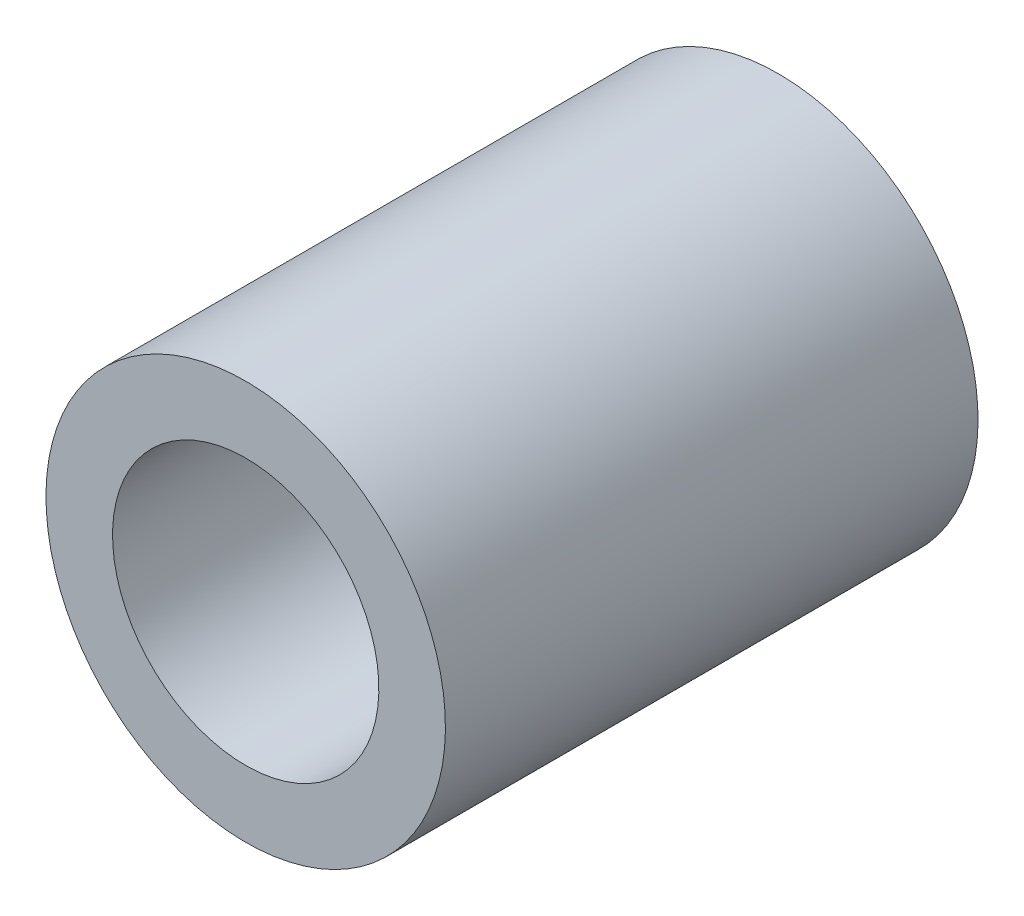
ISO-10303-21;
HEADER;
FILE_DESCRIPTION(('STEP AP214'),'2;1');
FILE_NAME('part.step','',(''),(''),'','','');
FILE_SCHEMA(('AUTOMOTIVE_DESIGN { 1 0 10303 214 1 1 1 1 }'));
ENDSEC;
DATA;
#1=APPLICATION_CONTEXT('core data for automotive mechanical design processes');
#2=APPLICATION_PROTOCOL_DEFINITION('international standard','automotive_design',2000,#1);
#3=PRODUCT_CONTEXT('',#1,'mechanical');
#4=PRODUCT('Part','Part','',(#3));
#5=PRODUCT_RELATED_PRODUCT_CATEGORY('part','',(#4));
#6=PRODUCT_DEFINITION_FORMATION('','',#4);
#7=PRODUCT_DEFINITION_CONTEXT('part definition',#1,'design');
#8=PRODUCT_DEFINITION('design','',#6,#7);
#9=PRODUCT_DEFINITION_SHAPE('','',#8);
#10=(LENGTH_UNIT() NAMED_UNIT(*) SI_UNIT(.MILLI.,.METRE.));
#11=(NAMED_UNIT(*) PLANE_ANGLE_UNIT() SI_UNIT($,.RADIAN.));
#12=(NAMED_UNIT(*) SI_UNIT($,.STERADIAN.) SOLID_ANGLE_UNIT());
#13=UNCERTAINTY_MEASURE_WITH_UNIT(LENGTH_MEASURE(1.E-05),#10,'distance_accuracy_value','');
#14=(GEOMETRIC_REPRESENTATION_CONTEXT(3) GLOBAL_UNCERTAINTY_ASSIGNED_CONTEXT((#13)) GLOBAL_UNIT_ASSIGNED_CONTEXT((#10,
#11,#12)) REPRESENTATION_CONTEXT('',''));
#15=CARTESIAN_POINT('',(0.,0.,0.));
#16=DIRECTION('',(0.,0.,1.));
#17=DIRECTION('',(1.,0.,0.));
#18=AXIS2_PLACEMENT_3D('',#15,#16,#17);
#19=CARTESIAN_POINT('',(69.9596903297769,144.74572943156,362.374757541018));
#20=DIRECTION('',(0.,0.,-1.));
#21=DIRECTION('',(0.173648177666928,0.984807753012209,0.));
#22=AXIS2_PLACEMENT_3D('',#19,#20,#21);
#23=CYLINDRICAL_SURFACE('',#22,2.);
#24=CARTESIAN_POINT('',(69.9596903297769,144.74572943156,356.374757541018));
#25=DIRECTION('',(0.,0.,-1.));
#26=DIRECTION('',(0.173648177666928,0.984807753012209,0.));
#27=AXIS2_PLACEMENT_3D('',#24,#25,#26);
#28=CIRCLE('',#27,2.);
#29=CARTESIAN_POINT('',(70.3069866851108,146.715344937585,356.374757541018));
#30=VERTEX_POINT('',#29);
#31=EDGE_CURVE('E11',#30,#30,#28,.T.);
#32=ORIENTED_EDGE('',*,*,#31,.T.);
#33=EDGE_LOOP('',(#32));
#34=FACE_BOUND('',#33,.T.);
#35=CARTESIAN_POINT('',(69.9596903297769,144.74572943156,364.374757541018));
#36=DIRECTION('',(0.,0.,-1.));
#37=DIRECTION('',(0.173648177666928,0.984807753012209,0.));
#38=AXIS2_PLACEMENT_3D('',#35,#36,#37);
#39=CIRCLE('',#38,2.);
#40=CARTESIAN_POINT('',(70.3069866851108,146.715344937585,364.374757541018));
#41=VERTEX_POINT('',#40);
#42=EDGE_CURVE('E70',#41,#41,#39,.T.);
#43=ORIENTED_EDGE('',*,*,#42,.F.);
#44=EDGE_LOOP('',(#43));
#45=FACE_BOUND('',#44,.T.);
#46=ADVANCED_FACE('F42',(#34,#45),#23,.F.);
#47=CARTESIAN_POINT('',(69.9596903297769,144.74572943156,362.374757541018));
#48=DIRECTION('',(0.,0.,-1.));
#49=DIRECTION('',(0.17364817766693,0.984807753012208,0.));
#50=AXIS2_PLACEMENT_3D('',#47,#48,#49);
#51=CYLINDRICAL_SURFACE('',#50,3.);
#52=CARTESIAN_POINT('',(69.9596903297769,144.74572943156,356.374757541018));
#53=DIRECTION('',(0.,0.,-1.));
#54=DIRECTION('',(0.17364817766693,0.984807753012208,0.));
#55=AXIS2_PLACEMENT_3D('',#52,#53,#54);
#56=CIRCLE('',#55,3.);
#57=CARTESIAN_POINT('',(70.4806348627777,147.700152690597,356.374757541018));
#58=VERTEX_POINT('',#57);
#59=EDGE_CURVE('E46',#58,#58,#56,.T.);
#60=ORIENTED_EDGE('',*,*,#59,.F.);
#61=EDGE_LOOP('',(#60));
#62=FACE_BOUND('',#61,.T.);
#63=CARTESIAN_POINT('',(69.9596903297769,144.74572943156,364.374757541018));
#64=DIRECTION('',(0.,0.,-1.));
#65=DIRECTION('',(0.17364817766693,0.984807753012208,0.));
#66=AXIS2_PLACEMENT_3D('',#63,#64,#65);
#67=CIRCLE('',#66,3.);
#68=CARTESIAN_POINT('',(70.4806348627777,147.700152690597,364.374757541018));
#69=VERTEX_POINT('',#68);
#70=EDGE_CURVE('E77',#69,#69,#67,.T.);
#71=ORIENTED_EDGE('',*,*,#70,.T.);
#72=EDGE_LOOP('',(#71));
#73=FACE_BOUND('',#72,.T.);
#74=ADVANCED_FACE('F78',(#62,#73),#51,.T.);
#75=CARTESIAN_POINT('',(69.9596903297769,144.74572943156,356.374757541018));
#76=DIRECTION('',(0.,0.,-1.));
#77=DIRECTION('',(-1.,0.,0.));
#78=AXIS2_PLACEMENT_3D('',#75,#76,#77);
#79=PLANE('',#78);
#80=ORIENTED_EDGE('',*,*,#31,.F.);
#81=EDGE_LOOP('',(#80));
#82=FACE_BOUND('',#81,.T.);
#83=ORIENTED_EDGE('',*,*,#59,.T.);
#84=EDGE_LOOP('',(#83));
#85=FACE_BOUND('',#84,.T.);
#86=ADVANCED_FACE('F90',(#82,#85),#79,.T.);
#87=CARTESIAN_POINT('',(69.9596903297769,144.74572943156,364.374757541018));
#88=DIRECTION('',(0.,0.,-1.));
#89=DIRECTION('',(-1.,0.,0.));
#90=AXIS2_PLACEMENT_3D('',#87,#88,#89);
#91=PLANE('',#90);
#92=ORIENTED_EDGE('',*,*,#42,.T.);
#93=EDGE_LOOP('',(#92));
#94=FACE_BOUND('',#93,.T.);
#95=ORIENTED_EDGE('',*,*,#70,.F.);
#96=EDGE_LOOP('',(#95));
#97=FACE_BOUND('',#96,.T.);
#98=ADVANCED_FACE('F44',(#94,#97),#91,.F.);
#99=CLOSED_SHELL('',(#46,#74,#86,#98));
#100=MANIFOLD_SOLID_BREP('B2',#99);
#101=ADVANCED_BREP_SHAPE_REPRESENTATION('',(#18,#100),#14);
#102=SHAPE_DEFINITION_REPRESENTATION(#9,#101);
ENDSEC;
END-ISO-10303-21;
